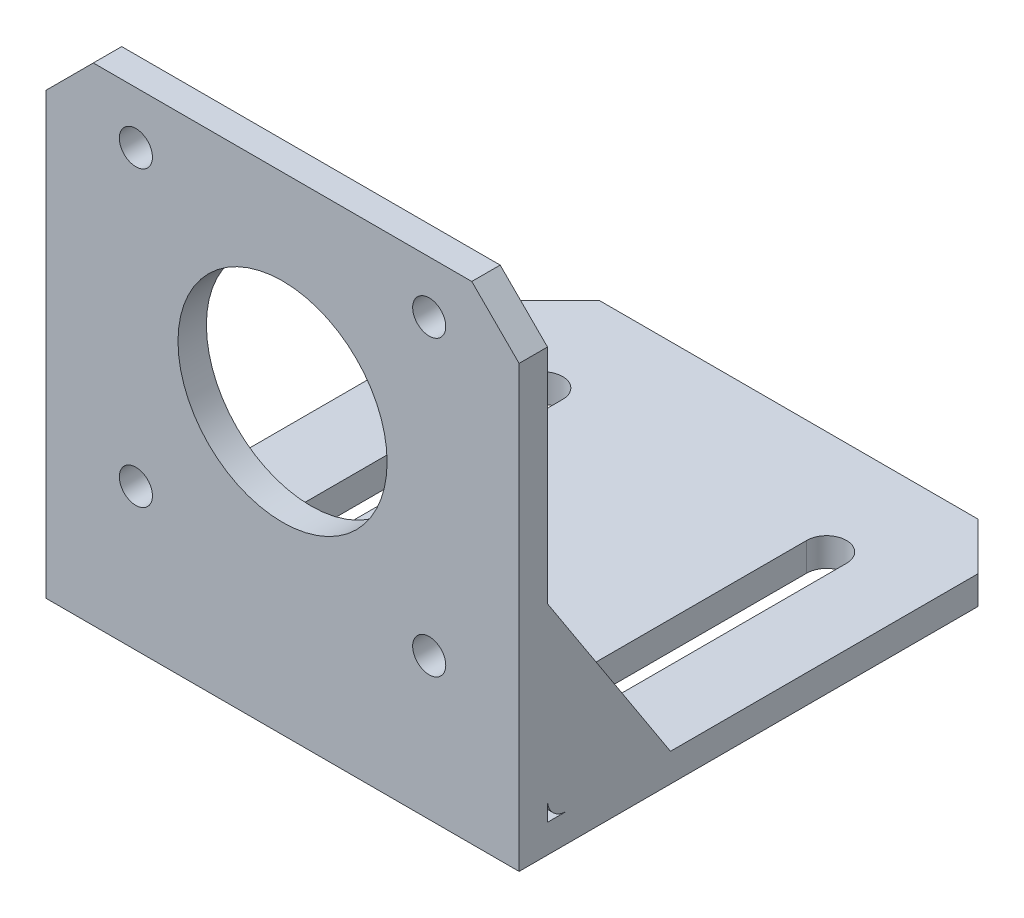
ISO-10303-21;
HEADER;
FILE_DESCRIPTION(('STEP AP214'),'2;1');
FILE_NAME('part.step','',(''),(''),'','','');
FILE_SCHEMA(('AUTOMOTIVE_DESIGN { 1 0 10303 214 1 1 1 1 }'));
ENDSEC;
DATA;
#1=APPLICATION_CONTEXT('core data for automotive mechanical design processes');
#2=APPLICATION_PROTOCOL_DEFINITION('international standard','automotive_design',2000,#1);
#3=PRODUCT_CONTEXT('',#1,'mechanical');
#4=PRODUCT('Part','Part','',(#3));
#5=PRODUCT_RELATED_PRODUCT_CATEGORY('part','',(#4));
#6=PRODUCT_DEFINITION_FORMATION('','',#4);
#7=PRODUCT_DEFINITION_CONTEXT('part definition',#1,'design');
#8=PRODUCT_DEFINITION('design','',#6,#7);
#9=PRODUCT_DEFINITION_SHAPE('','',#8);
#10=(LENGTH_UNIT() NAMED_UNIT(*) SI_UNIT(.MILLI.,.METRE.));
#11=(NAMED_UNIT(*) PLANE_ANGLE_UNIT() SI_UNIT($,.RADIAN.));
#12=(NAMED_UNIT(*) SI_UNIT($,.STERADIAN.) SOLID_ANGLE_UNIT());
#13=UNCERTAINTY_MEASURE_WITH_UNIT(LENGTH_MEASURE(1.E-05),#10,'distance_accuracy_value','');
#14=(GEOMETRIC_REPRESENTATION_CONTEXT(3) GLOBAL_UNCERTAINTY_ASSIGNED_CONTEXT((#13)) GLOBAL_UNIT_ASSIGNED_CONTEXT((#10,
#11,#12)) REPRESENTATION_CONTEXT('',''));
#15=CARTESIAN_POINT('',(0.,0.,0.));
#16=DIRECTION('',(0.,0.,1.));
#17=DIRECTION('',(1.,0.,0.));
#18=AXIS2_PLACEMENT_3D('',#15,#16,#17);
#19=CARTESIAN_POINT('',(50.,-51.5,0.));
#20=DIRECTION('',(0.,0.,-1.));
#21=DIRECTION('',(-1.,0.,0.));
#22=AXIS2_PLACEMENT_3D('',#19,#20,#21);
#23=PLANE('',#22);
#24=CARTESIAN_POINT('',(40.5,-36.5,0.));
#25=DIRECTION('',(0.,0.,-1.));
#26=DIRECTION('',(0.,1.,0.));
#27=AXIS2_PLACEMENT_3D('',#24,#25,#26);
#28=CIRCLE('',#27,1.75);
#29=CARTESIAN_POINT('',(40.5,-34.75,0.));
#30=VERTEX_POINT('',#29);
#31=EDGE_CURVE('E333',#30,#30,#28,.T.);
#32=ORIENTED_EDGE('',*,*,#31,.T.);
#33=EDGE_LOOP('',(#32));
#34=FACE_BOUND('',#33,.T.);
#35=CARTESIAN_POINT('',(9.5,-36.5,0.));
#36=DIRECTION('',(0.,0.,-1.));
#37=DIRECTION('',(0.,1.,0.));
#38=AXIS2_PLACEMENT_3D('',#35,#36,#37);
#39=CIRCLE('',#38,1.75);
#40=CARTESIAN_POINT('',(9.5,-34.75,0.));
#41=VERTEX_POINT('',#40);
#42=EDGE_CURVE('E352',#41,#41,#39,.T.);
#43=ORIENTED_EDGE('',*,*,#42,.T.);
#44=EDGE_LOOP('',(#43));
#45=FACE_BOUND('',#44,.T.);
#46=CARTESIAN_POINT('',(9.5,-5.50000000000001,0.));
#47=DIRECTION('',(0.,0.,-1.));
#48=DIRECTION('',(0.,1.,0.));
#49=AXIS2_PLACEMENT_3D('',#46,#47,#48);
#50=CIRCLE('',#49,1.75);
#51=CARTESIAN_POINT('',(9.5,-3.75,0.));
#52=VERTEX_POINT('',#51);
#53=EDGE_CURVE('E346',#52,#52,#50,.T.);
#54=ORIENTED_EDGE('',*,*,#53,.T.);
#55=EDGE_LOOP('',(#54));
#56=FACE_BOUND('',#55,.T.);
#57=CARTESIAN_POINT('',(40.5,-5.50000000000001,0.));
#58=DIRECTION('',(0.,0.,-1.));
#59=DIRECTION('',(0.,1.,0.));
#60=AXIS2_PLACEMENT_3D('',#57,#58,#59);
#61=CIRCLE('',#60,1.75);
#62=CARTESIAN_POINT('',(40.5,-3.75,0.));
#63=VERTEX_POINT('',#62);
#64=EDGE_CURVE('E360',#63,#63,#61,.T.);
#65=ORIENTED_EDGE('',*,*,#64,.T.);
#66=EDGE_LOOP('',(#65));
#67=FACE_BOUND('',#66,.T.);
#68=CARTESIAN_POINT('',(25.,-21.,0.));
#69=DIRECTION('',(0.,0.,-1.));
#70=DIRECTION('',(0.,1.,0.));
#71=AXIS2_PLACEMENT_3D('',#68,#69,#70);
#72=CIRCLE('',#71,11.05);
#73=CARTESIAN_POINT('',(25.,-9.95,0.));
#74=VERTEX_POINT('',#73);
#75=EDGE_CURVE('E366',#74,#74,#72,.T.);
#76=ORIENTED_EDGE('',*,*,#75,.T.);
#77=EDGE_LOOP('',(#76));
#78=FACE_BOUND('',#77,.T.);
#79=DIRECTION('',(0.,-1.,0.));
#80=VECTOR('',#79,1.);
#81=CARTESIAN_POINT('',(50.,-51.5,0.));
#82=LINE('',#81,#80);
#83=CARTESIAN_POINT('',(50.,-4.99999999999999,0.));
#84=VERTEX_POINT('',#83);
#85=CARTESIAN_POINT('',(50.,-51.5,0.));
#86=VERTEX_POINT('',#85);
#87=EDGE_CURVE('E372',#84,#86,#82,.T.);
#88=ORIENTED_EDGE('',*,*,#87,.F.);
#89=DIRECTION('',(0.707106781186549,-0.707106781186547,0.));
#90=VECTOR('',#89,1.);
#91=CARTESIAN_POINT('',(50.,-4.99999999999999,0.));
#92=LINE('',#91,#90);
#93=CARTESIAN_POINT('',(45.,0.,0.));
#94=VERTEX_POINT('',#93);
#95=EDGE_CURVE('E439',#84,#94,#92,.F.);
#96=ORIENTED_EDGE('',*,*,#95,.T.);
#97=DIRECTION('',(-1.,0.,0.));
#98=VECTOR('',#97,1.);
#99=CARTESIAN_POINT('',(50.,0.,0.));
#100=LINE('',#99,#98);
#101=CARTESIAN_POINT('',(4.99999999999999,0.,0.));
#102=VERTEX_POINT('',#101);
#103=EDGE_CURVE('E386',#94,#102,#100,.T.);
#104=ORIENTED_EDGE('',*,*,#103,.T.);
#105=DIRECTION('',(-0.707106781186547,-0.707106781186549,0.));
#106=VECTOR('',#105,1.);
#107=CARTESIAN_POINT('',(4.99999999999999,0.,0.));
#108=LINE('',#107,#106);
#109=CARTESIAN_POINT('',(0.,-5.,0.));
#110=VERTEX_POINT('',#109);
#111=EDGE_CURVE('E437',#102,#110,#108,.T.);
#112=ORIENTED_EDGE('',*,*,#111,.T.);
#113=DIRECTION('',(0.,-1.,0.));
#114=VECTOR('',#113,1.);
#115=CARTESIAN_POINT('',(0.,-51.5,0.));
#116=LINE('',#115,#114);
#117=CARTESIAN_POINT('',(0.,-51.5,0.));
#118=VERTEX_POINT('',#117);
#119=EDGE_CURVE('E369',#110,#118,#116,.T.);
#120=ORIENTED_EDGE('',*,*,#119,.T.);
#121=DIRECTION('',(-1.,0.,0.));
#122=VECTOR('',#121,1.);
#123=CARTESIAN_POINT('',(50.,-51.5,0.));
#124=LINE('',#123,#122);
#125=EDGE_CURVE('E410',#86,#118,#124,.T.);
#126=ORIENTED_EDGE('',*,*,#125,.F.);
#127=EDGE_LOOP('',(#88,#96,#104,#112,#120,#126));
#128=FACE_BOUND('',#127,.T.);
#129=ADVANCED_FACE('F41',(#34,#45,#56,#67,#78,#128),#23,.F.);
#130=CARTESIAN_POINT('',(50.,-51.5,-53.5));
#131=DIRECTION('',(0.,1.,0.));
#132=DIRECTION('',(0.,0.,1.));
#133=AXIS2_PLACEMENT_3D('',#130,#131,#132);
#134=PLANE('',#133);
#135=DIRECTION('',(0.,0.,-1.));
#136=VECTOR('',#135,1.);
#137=CARTESIAN_POINT('',(12.1,-51.5,-42.5));
#138=LINE('',#137,#136);
#139=CARTESIAN_POINT('',(12.1,-51.5,-12.5));
#140=VERTEX_POINT('',#139);
#141=CARTESIAN_POINT('',(12.1,-51.5,-42.5));
#142=VERTEX_POINT('',#141);
#143=EDGE_CURVE('E227',#140,#142,#138,.T.);
#144=ORIENTED_EDGE('',*,*,#143,.T.);
#145=CARTESIAN_POINT('',(9.99999999999999,-51.5,-42.5));
#146=DIRECTION('',(0.,1.,0.));
#147=DIRECTION('',(0.,0.,1.));
#148=AXIS2_PLACEMENT_3D('',#145,#146,#147);
#149=CIRCLE('',#148,2.1);
#150=CARTESIAN_POINT('',(7.89999999999999,-51.5,-42.5));
#151=VERTEX_POINT('',#150);
#152=EDGE_CURVE('E219',#142,#151,#149,.T.);
#153=ORIENTED_EDGE('',*,*,#152,.T.);
#154=DIRECTION('',(0.,0.,1.));
#155=VECTOR('',#154,1.);
#156=CARTESIAN_POINT('',(7.89999999999999,-51.5,-42.5));
#157=LINE('',#156,#155);
#158=CARTESIAN_POINT('',(7.89999999999999,-51.5,-12.5));
#159=VERTEX_POINT('',#158);
#160=EDGE_CURVE('E230',#151,#159,#157,.T.);
#161=ORIENTED_EDGE('',*,*,#160,.T.);
#162=CARTESIAN_POINT('',(9.99999999999999,-51.5,-12.5));
#163=DIRECTION('',(0.,1.,0.));
#164=DIRECTION('',(0.,0.,1.));
#165=AXIS2_PLACEMENT_3D('',#162,#163,#164);
#166=CIRCLE('',#165,2.1);
#167=EDGE_CURVE('E57',#159,#140,#166,.T.);
#168=ORIENTED_EDGE('',*,*,#167,.T.);
#169=EDGE_LOOP('',(#144,#153,#161,#168));
#170=FACE_BOUND('',#169,.T.);
#171=DIRECTION('',(0.,0.,-1.));
#172=VECTOR('',#171,1.);
#173=CARTESIAN_POINT('',(42.1,-51.5,-42.5));
#174=LINE('',#173,#172);
#175=CARTESIAN_POINT('',(42.1,-51.5,-12.5));
#176=VERTEX_POINT('',#175);
#177=CARTESIAN_POINT('',(42.1,-51.5,-42.5));
#178=VERTEX_POINT('',#177);
#179=EDGE_CURVE('E260',#176,#178,#174,.T.);
#180=ORIENTED_EDGE('',*,*,#179,.T.);
#181=CARTESIAN_POINT('',(40.,-51.5,-42.5));
#182=DIRECTION('',(0.,1.,0.));
#183=DIRECTION('',(0.,0.,1.));
#184=AXIS2_PLACEMENT_3D('',#181,#182,#183);
#185=CIRCLE('',#184,2.1);
#186=CARTESIAN_POINT('',(37.9,-51.5,-42.5));
#187=VERTEX_POINT('',#186);
#188=EDGE_CURVE('E271',#178,#187,#185,.T.);
#189=ORIENTED_EDGE('',*,*,#188,.T.);
#190=DIRECTION('',(0.,0.,1.));
#191=VECTOR('',#190,1.);
#192=CARTESIAN_POINT('',(37.9,-51.5,-42.5));
#193=LINE('',#192,#191);
#194=CARTESIAN_POINT('',(37.9,-51.5,-12.5));
#195=VERTEX_POINT('',#194);
#196=EDGE_CURVE('E281',#187,#195,#193,.T.);
#197=ORIENTED_EDGE('',*,*,#196,.T.);
#198=CARTESIAN_POINT('',(40.,-51.5,-12.5));
#199=DIRECTION('',(0.,1.,0.));
#200=DIRECTION('',(0.,0.,1.));
#201=AXIS2_PLACEMENT_3D('',#198,#199,#200);
#202=CIRCLE('',#201,2.10000000000001);
#203=EDGE_CURVE('E65',#195,#176,#202,.T.);
#204=ORIENTED_EDGE('',*,*,#203,.T.);
#205=EDGE_LOOP('',(#180,#189,#197,#204));
#206=FACE_BOUND('',#205,.T.);
#207=DIRECTION('',(0.,0.,-1.));
#208=VECTOR('',#207,1.);
#209=CARTESIAN_POINT('',(0.,-51.5,-53.5));
#210=LINE('',#209,#208);
#211=CARTESIAN_POINT('',(0.,-51.5,-48.5));
#212=VERTEX_POINT('',#211);
#213=EDGE_CURVE('E388',#118,#212,#210,.T.);
#214=ORIENTED_EDGE('',*,*,#213,.T.);
#215=DIRECTION('',(0.707106781186547,0.,-0.707106781186548));
#216=VECTOR('',#215,1.);
#217=CARTESIAN_POINT('',(4.99999999999998,-51.5,-53.5));
#218=LINE('',#217,#216);
#219=CARTESIAN_POINT('',(4.99999999999999,-51.5,-53.5));
#220=VERTEX_POINT('',#219);
#221=EDGE_CURVE('E429',#212,#220,#218,.T.);
#222=ORIENTED_EDGE('',*,*,#221,.T.);
#223=DIRECTION('',(-1.,0.,0.));
#224=VECTOR('',#223,1.);
#225=CARTESIAN_POINT('',(50.,-51.5,-53.5));
#226=LINE('',#225,#224);
#227=CARTESIAN_POINT('',(45.,-51.5,-53.5));
#228=VERTEX_POINT('',#227);
#229=EDGE_CURVE('E407',#228,#220,#226,.T.);
#230=ORIENTED_EDGE('',*,*,#229,.F.);
#231=DIRECTION('',(-0.70710678118655,0.,-0.707106781186545));
#232=VECTOR('',#231,1.);
#233=CARTESIAN_POINT('',(50.0000000000001,-51.5,-48.4999999999999));
#234=LINE('',#233,#232);
#235=CARTESIAN_POINT('',(50.,-51.5,-48.5));
#236=VERTEX_POINT('',#235);
#237=EDGE_CURVE('E427',#228,#236,#234,.F.);
#238=ORIENTED_EDGE('',*,*,#237,.T.);
#239=DIRECTION('',(0.,0.,-1.));
#240=VECTOR('',#239,1.);
#241=CARTESIAN_POINT('',(50.,-51.5,-53.5));
#242=LINE('',#241,#240);
#243=EDGE_CURVE('E374',#86,#236,#242,.T.);
#244=ORIENTED_EDGE('',*,*,#243,.F.);
#245=ORIENTED_EDGE('',*,*,#125,.T.);
#246=EDGE_LOOP('',(#214,#222,#230,#238,#244,#245));
#247=FACE_BOUND('',#246,.T.);
#248=ADVANCED_FACE('F234',(#170,#206,#247),#134,.F.);
#249=CARTESIAN_POINT('',(50.,-48.5,-53.5));
#250=DIRECTION('',(0.,0.,1.));
#251=DIRECTION('',(0.,-1.,0.));
#252=AXIS2_PLACEMENT_3D('',#249,#250,#251);
#253=PLANE('',#252);
#254=ORIENTED_EDGE('',*,*,#229,.T.);
#255=DIRECTION('',(0.,1.,0.));
#256=VECTOR('',#255,1.);
#257=CARTESIAN_POINT('',(4.99999999999999,-48.5,-53.5));
#258=LINE('',#257,#256);
#259=CARTESIAN_POINT('',(4.99999999999999,-48.5,-53.5));
#260=VERTEX_POINT('',#259);
#261=EDGE_CURVE('E415',#220,#260,#258,.T.);
#262=ORIENTED_EDGE('',*,*,#261,.T.);
#263=DIRECTION('',(-1.,0.,0.));
#264=VECTOR('',#263,1.);
#265=CARTESIAN_POINT('',(50.,-48.5,-53.5));
#266=LINE('',#265,#264);
#267=CARTESIAN_POINT('',(45.,-48.5,-53.5));
#268=VERTEX_POINT('',#267);
#269=EDGE_CURVE('E404',#268,#260,#266,.T.);
#270=ORIENTED_EDGE('',*,*,#269,.F.);
#271=DIRECTION('',(0.,-1.,0.));
#272=VECTOR('',#271,1.);
#273=CARTESIAN_POINT('',(45.,-48.5,-53.5));
#274=LINE('',#273,#272);
#275=EDGE_CURVE('E413',#268,#228,#274,.T.);
#276=ORIENTED_EDGE('',*,*,#275,.T.);
#277=EDGE_LOOP('',(#254,#262,#270,#276));
#278=FACE_BOUND('',#277,.T.);
#279=ADVANCED_FACE('F516',(#278),#253,.F.);
#280=CARTESIAN_POINT('',(50.,-48.5,-3.00000000000001));
#281=DIRECTION('',(0.,-1.,0.));
#282=DIRECTION('',(0.,0.,-1.));
#283=AXIS2_PLACEMENT_3D('',#280,#281,#282);
#284=PLANE('',#283);
#285=DIRECTION('',(0.,0.,1.));
#286=VECTOR('',#285,1.);
#287=CARTESIAN_POINT('',(7.89999999999999,-48.5,-42.5));
#288=LINE('',#287,#286);
#289=CARTESIAN_POINT('',(7.89999999999999,-48.5,-42.5));
#290=VERTEX_POINT('',#289);
#291=CARTESIAN_POINT('',(7.89999999999999,-48.5,-12.5));
#292=VERTEX_POINT('',#291);
#293=EDGE_CURVE('E246',#290,#292,#288,.T.);
#294=ORIENTED_EDGE('',*,*,#293,.F.);
#295=CARTESIAN_POINT('',(9.99999999999999,-48.5,-42.5));
#296=DIRECTION('',(0.,1.,0.));
#297=DIRECTION('',(0.,0.,1.));
#298=AXIS2_PLACEMENT_3D('',#295,#296,#297);
#299=CIRCLE('',#298,2.1);
#300=CARTESIAN_POINT('',(12.1,-48.5,-42.5));
#301=VERTEX_POINT('',#300);
#302=EDGE_CURVE('E222',#301,#290,#299,.T.);
#303=ORIENTED_EDGE('',*,*,#302,.F.);
#304=DIRECTION('',(0.,0.,-1.));
#305=VECTOR('',#304,1.);
#306=CARTESIAN_POINT('',(12.1,-48.5,-42.5));
#307=LINE('',#306,#305);
#308=CARTESIAN_POINT('',(12.1,-48.5,-12.5));
#309=VERTEX_POINT('',#308);
#310=EDGE_CURVE('E237',#309,#301,#307,.T.);
#311=ORIENTED_EDGE('',*,*,#310,.F.);
#312=CARTESIAN_POINT('',(9.99999999999999,-48.5,-12.5));
#313=DIRECTION('',(0.,1.,0.));
#314=DIRECTION('',(0.,0.,1.));
#315=AXIS2_PLACEMENT_3D('',#312,#313,#314);
#316=CIRCLE('',#315,2.1);
#317=EDGE_CURVE('E240',#292,#309,#316,.T.);
#318=ORIENTED_EDGE('',*,*,#317,.F.);
#319=EDGE_LOOP('',(#294,#303,#311,#318));
#320=FACE_BOUND('',#319,.T.);
#321=DIRECTION('',(0.,0.,1.));
#322=VECTOR('',#321,1.);
#323=CARTESIAN_POINT('',(37.9,-48.5,-42.5));
#324=LINE('',#323,#322);
#325=CARTESIAN_POINT('',(37.9,-48.5,-42.5));
#326=VERTEX_POINT('',#325);
#327=CARTESIAN_POINT('',(37.9,-48.5,-12.5));
#328=VERTEX_POINT('',#327);
#329=EDGE_CURVE('E274',#326,#328,#324,.T.);
#330=ORIENTED_EDGE('',*,*,#329,.F.);
#331=CARTESIAN_POINT('',(40.,-48.5,-42.5));
#332=DIRECTION('',(0.,1.,0.));
#333=DIRECTION('',(0.,0.,1.));
#334=AXIS2_PLACEMENT_3D('',#331,#332,#333);
#335=CIRCLE('',#334,2.1);
#336=CARTESIAN_POINT('',(42.1,-48.5,-42.5));
#337=VERTEX_POINT('',#336);
#338=EDGE_CURVE('E247',#337,#326,#335,.T.);
#339=ORIENTED_EDGE('',*,*,#338,.F.);
#340=DIRECTION('',(0.,0.,-1.));
#341=VECTOR('',#340,1.);
#342=CARTESIAN_POINT('',(42.1,-48.5,-42.5));
#343=LINE('',#342,#341);
#344=CARTESIAN_POINT('',(42.1,-48.5,-12.5));
#345=VERTEX_POINT('',#344);
#346=EDGE_CURVE('E267',#345,#337,#343,.T.);
#347=ORIENTED_EDGE('',*,*,#346,.F.);
#348=CARTESIAN_POINT('',(40.,-48.5,-12.5));
#349=DIRECTION('',(0.,1.,0.));
#350=DIRECTION('',(0.,0.,1.));
#351=AXIS2_PLACEMENT_3D('',#348,#349,#350);
#352=CIRCLE('',#351,2.10000000000001);
#353=EDGE_CURVE('E270',#328,#345,#352,.T.);
#354=ORIENTED_EDGE('',*,*,#353,.F.);
#355=EDGE_LOOP('',(#330,#339,#347,#354));
#356=FACE_BOUND('',#355,.T.);
#357=DIRECTION('',(0.,0.,1.));
#358=VECTOR('',#357,1.);
#359=CARTESIAN_POINT('',(0.,-48.5,-3.00000000000001));
#360=LINE('',#359,#358);
#361=CARTESIAN_POINT('',(0.,-48.5,-48.5));
#362=VERTEX_POINT('',#361);
#363=CARTESIAN_POINT('',(0.,-48.5,-16.));
#364=VERTEX_POINT('',#363);
#365=EDGE_CURVE('E392',#362,#364,#360,.T.);
#366=ORIENTED_EDGE('',*,*,#365,.T.);
#367=DIRECTION('',(-1.,0.,0.));
#368=VECTOR('',#367,1.);
#369=CARTESIAN_POINT('',(3.,-48.5,-16.));
#370=LINE('',#369,#368);
#371=CARTESIAN_POINT('',(3.,-48.5,-16.));
#372=VERTEX_POINT('',#371);
#373=EDGE_CURVE('E297',#372,#364,#370,.T.);
#374=ORIENTED_EDGE('',*,*,#373,.F.);
#375=DIRECTION('',(0.,0.,1.));
#376=VECTOR('',#375,1.);
#377=CARTESIAN_POINT('',(3.,-48.5,-5.00000000000002));
#378=LINE('',#377,#376);
#379=CARTESIAN_POINT('',(3.,-48.5,-5.00000000000001));
#380=VERTEX_POINT('',#379);
#381=EDGE_CURVE('E289',#372,#380,#378,.T.);
#382=ORIENTED_EDGE('',*,*,#381,.T.);
#383=DIRECTION('',(-1.,0.,0.));
#384=VECTOR('',#383,1.);
#385=CARTESIAN_POINT('',(3.,-48.5,-5.00000000000002));
#386=LINE('',#385,#384);
#387=CARTESIAN_POINT('',(0.,-48.5,-5.00000000000002));
#388=VERTEX_POINT('',#387);
#389=EDGE_CURVE('E309',#380,#388,#386,.T.);
#390=ORIENTED_EDGE('',*,*,#389,.T.);
#391=CARTESIAN_POINT('',(0.,-48.5,-3.00000000000001));
#392=VERTEX_POINT('',#391);
#393=EDGE_CURVE('E391',#388,#392,#360,.T.);
#394=ORIENTED_EDGE('',*,*,#393,.T.);
#395=DIRECTION('',(-1.,0.,0.));
#396=VECTOR('',#395,1.);
#397=CARTESIAN_POINT('',(50.,-48.5,-3.00000000000001));
#398=LINE('',#397,#396);
#399=CARTESIAN_POINT('',(50.,-48.5,-3.00000000000001));
#400=VERTEX_POINT('',#399);
#401=EDGE_CURVE('E401',#400,#392,#398,.T.);
#402=ORIENTED_EDGE('',*,*,#401,.F.);
#403=DIRECTION('',(0.,0.,1.));
#404=VECTOR('',#403,1.);
#405=CARTESIAN_POINT('',(50.,-48.5,-3.00000000000001));
#406=LINE('',#405,#404);
#407=CARTESIAN_POINT('',(50.,-48.5,-5.00000000000001));
#408=VERTEX_POINT('',#407);
#409=EDGE_CURVE('E378',#408,#400,#406,.T.);
#410=ORIENTED_EDGE('',*,*,#409,.F.);
#411=DIRECTION('',(1.,0.,0.));
#412=VECTOR('',#411,1.);
#413=CARTESIAN_POINT('',(47.,-48.5,-5.00000000000002));
#414=LINE('',#413,#412);
#415=CARTESIAN_POINT('',(47.,-48.5,-5.00000000000002));
#416=VERTEX_POINT('',#415);
#417=EDGE_CURVE('E337',#416,#408,#414,.T.);
#418=ORIENTED_EDGE('',*,*,#417,.F.);
#419=DIRECTION('',(0.,0.,-1.));
#420=VECTOR('',#419,1.);
#421=CARTESIAN_POINT('',(47.,-48.5,-5.00000000000002));
#422=LINE('',#421,#420);
#423=CARTESIAN_POINT('',(47.,-48.5,-16.));
#424=VERTEX_POINT('',#423);
#425=EDGE_CURVE('E321',#416,#424,#422,.T.);
#426=ORIENTED_EDGE('',*,*,#425,.T.);
#427=DIRECTION('',(1.,0.,0.));
#428=VECTOR('',#427,1.);
#429=CARTESIAN_POINT('',(47.,-48.5,-16.));
#430=LINE('',#429,#428);
#431=CARTESIAN_POINT('',(50.,-48.5,-16.));
#432=VERTEX_POINT('',#431);
#433=EDGE_CURVE('E334',#424,#432,#430,.T.);
#434=ORIENTED_EDGE('',*,*,#433,.T.);
#435=CARTESIAN_POINT('',(50.,-48.5,-48.5));
#436=VERTEX_POINT('',#435);
#437=EDGE_CURVE('E379',#436,#432,#406,.T.);
#438=ORIENTED_EDGE('',*,*,#437,.F.);
#439=DIRECTION('',(0.70710678118655,0.,0.707106781186545));
#440=VECTOR('',#439,1.);
#441=CARTESIAN_POINT('',(50.0000000000001,-48.5,-48.4999999999999));
#442=LINE('',#441,#440);
#443=EDGE_CURVE('E418',#436,#268,#442,.F.);
#444=ORIENTED_EDGE('',*,*,#443,.T.);
#445=ORIENTED_EDGE('',*,*,#269,.T.);
#446=DIRECTION('',(-0.707106781186547,0.,0.707106781186548));
#447=VECTOR('',#446,1.);
#448=CARTESIAN_POINT('',(4.99999999999999,-48.5,-53.5));
#449=LINE('',#448,#447);
#450=EDGE_CURVE('E420',#260,#362,#449,.T.);
#451=ORIENTED_EDGE('',*,*,#450,.T.);
#452=EDGE_LOOP('',(#366,#374,#382,#390,#394,#402,#410,#418,#426,#434,#438,#444,#445,#451));
#453=FACE_BOUND('',#452,.T.);
#454=ADVANCED_FACE('F487',(#320,#356,#453),#284,.F.);
#455=CARTESIAN_POINT('',(50.,0.,-3.));
#456=DIRECTION('',(0.,0.,1.));
#457=DIRECTION('',(0.,-1.,0.));
#458=AXIS2_PLACEMENT_3D('',#455,#456,#457);
#459=PLANE('',#458);
#460=DIRECTION('',(0.,1.,0.));
#461=VECTOR('',#460,1.);
#462=CARTESIAN_POINT('',(3.,-28.5,-3.00000000000001));
#463=LINE('',#462,#461);
#464=CARTESIAN_POINT('',(3.,-46.5,-3.00000000000001));
#465=VERTEX_POINT('',#464);
#466=CARTESIAN_POINT('',(3.,-28.5,-3.));
#467=VERTEX_POINT('',#466);
#468=EDGE_CURVE('E295',#465,#467,#463,.T.);
#469=ORIENTED_EDGE('',*,*,#468,.T.);
#470=DIRECTION('',(-1.,0.,0.));
#471=VECTOR('',#470,1.);
#472=CARTESIAN_POINT('',(3.,-28.5,-3.00000000000001));
#473=LINE('',#472,#471);
#474=CARTESIAN_POINT('',(0.,-28.5,-3.00000000000001));
#475=VERTEX_POINT('',#474);
#476=EDGE_CURVE('E302',#467,#475,#473,.T.);
#477=ORIENTED_EDGE('',*,*,#476,.T.);
#478=DIRECTION('',(0.,1.,0.));
#479=VECTOR('',#478,1.);
#480=CARTESIAN_POINT('',(0.,0.,-3.));
#481=LINE('',#480,#479);
#482=CARTESIAN_POINT('',(0.,-5.,-3.));
#483=VERTEX_POINT('',#482);
#484=EDGE_CURVE('E394',#475,#483,#481,.T.);
#485=ORIENTED_EDGE('',*,*,#484,.T.);
#486=DIRECTION('',(0.707106781186546,0.707106781186548,0.));
#487=VECTOR('',#486,1.);
#488=CARTESIAN_POINT('',(4.99999999999999,0.,-3.));
#489=LINE('',#488,#487);
#490=CARTESIAN_POINT('',(4.99999999999999,0.,-3.));
#491=VERTEX_POINT('',#490);
#492=EDGE_CURVE('E50',#483,#491,#489,.T.);
#493=ORIENTED_EDGE('',*,*,#492,.T.);
#494=DIRECTION('',(-1.,0.,0.));
#495=VECTOR('',#494,1.);
#496=CARTESIAN_POINT('',(50.,0.,-3.));
#497=LINE('',#496,#495);
#498=CARTESIAN_POINT('',(45.,0.,-3.));
#499=VERTEX_POINT('',#498);
#500=EDGE_CURVE('E398',#499,#491,#497,.T.);
#501=ORIENTED_EDGE('',*,*,#500,.F.);
#502=DIRECTION('',(-0.707106781186548,0.707106781186546,0.));
#503=VECTOR('',#502,1.);
#504=CARTESIAN_POINT('',(50.,-4.99999999999999,-3.));
#505=LINE('',#504,#503);
#506=CARTESIAN_POINT('',(50.,-4.99999999999999,-3.));
#507=VERTEX_POINT('',#506);
#508=EDGE_CURVE('E11',#499,#507,#505,.F.);
#509=ORIENTED_EDGE('',*,*,#508,.T.);
#510=DIRECTION('',(0.,1.,0.));
#511=VECTOR('',#510,1.);
#512=CARTESIAN_POINT('',(50.,0.,-3.));
#513=LINE('',#512,#511);
#514=CARTESIAN_POINT('',(50.,-28.5,-3.));
#515=VERTEX_POINT('',#514);
#516=EDGE_CURVE('E382',#515,#507,#513,.T.);
#517=ORIENTED_EDGE('',*,*,#516,.F.);
#518=DIRECTION('',(1.,0.,0.));
#519=VECTOR('',#518,1.);
#520=CARTESIAN_POINT('',(47.,-28.5,-3.00000000000001));
#521=LINE('',#520,#519);
#522=CARTESIAN_POINT('',(47.,-28.5,-3.00000000000001));
#523=VERTEX_POINT('',#522);
#524=EDGE_CURVE('E330',#523,#515,#521,.T.);
#525=ORIENTED_EDGE('',*,*,#524,.F.);
#526=DIRECTION('',(0.,-1.,0.));
#527=VECTOR('',#526,1.);
#528=CARTESIAN_POINT('',(47.,-28.5,-3.00000000000001));
#529=LINE('',#528,#527);
#530=CARTESIAN_POINT('',(47.,-46.5,-3.00000000000001));
#531=VERTEX_POINT('',#530);
#532=EDGE_CURVE('E314',#523,#531,#529,.T.);
#533=ORIENTED_EDGE('',*,*,#532,.T.);
#534=DIRECTION('',(1.,0.,0.));
#535=VECTOR('',#534,1.);
#536=CARTESIAN_POINT('',(47.,-46.5,-3.00000000000001));
#537=LINE('',#536,#535);
#538=CARTESIAN_POINT('',(50.,-46.5,-3.00000000000001));
#539=VERTEX_POINT('',#538);
#540=EDGE_CURVE('E327',#531,#539,#537,.T.);
#541=ORIENTED_EDGE('',*,*,#540,.T.);
#542=EDGE_CURVE('E383',#400,#539,#513,.T.);
#543=ORIENTED_EDGE('',*,*,#542,.F.);
#544=ORIENTED_EDGE('',*,*,#401,.T.);
#545=CARTESIAN_POINT('',(0.,-46.5,-3.00000000000001));
#546=VERTEX_POINT('',#545);
#547=EDGE_CURVE('E375',#392,#546,#481,.T.);
#548=ORIENTED_EDGE('',*,*,#547,.T.);
#549=DIRECTION('',(-1.,0.,0.));
#550=VECTOR('',#549,1.);
#551=CARTESIAN_POINT('',(3.,-46.5,-3.00000000000001));
#552=LINE('',#551,#550);
#553=EDGE_CURVE('E306',#465,#546,#552,.T.);
#554=ORIENTED_EDGE('',*,*,#553,.F.);
#555=EDGE_LOOP('',(#469,#477,#485,#493,#501,#509,#517,#525,#533,#541,#543,#544,#548,#554));
#556=FACE_BOUND('',#555,.T.);
#557=CARTESIAN_POINT('',(40.5,-36.5,-3.));
#558=DIRECTION('',(0.,0.,-1.));
#559=DIRECTION('',(0.,1.,0.));
#560=AXIS2_PLACEMENT_3D('',#557,#558,#559);
#561=CIRCLE('',#560,1.75);
#562=CARTESIAN_POINT('',(40.5,-34.75,-3.));
#563=VERTEX_POINT('',#562);
#564=EDGE_CURVE('E355',#563,#563,#561,.T.);
#565=ORIENTED_EDGE('',*,*,#564,.F.);
#566=EDGE_LOOP('',(#565));
#567=FACE_BOUND('',#566,.T.);
#568=CARTESIAN_POINT('',(9.5,-36.5,-3.));
#569=DIRECTION('',(0.,0.,-1.));
#570=DIRECTION('',(0.,1.,0.));
#571=AXIS2_PLACEMENT_3D('',#568,#569,#570);
#572=CIRCLE('',#571,1.75);
#573=CARTESIAN_POINT('',(9.5,-34.75,-3.));
#574=VERTEX_POINT('',#573);
#575=EDGE_CURVE('E349',#574,#574,#572,.T.);
#576=ORIENTED_EDGE('',*,*,#575,.F.);
#577=EDGE_LOOP('',(#576));
#578=FACE_BOUND('',#577,.T.);
#579=CARTESIAN_POINT('',(9.5,-5.50000000000001,-3.));
#580=DIRECTION('',(0.,0.,-1.));
#581=DIRECTION('',(0.,1.,0.));
#582=AXIS2_PLACEMENT_3D('',#579,#580,#581);
#583=CIRCLE('',#582,1.75);
#584=CARTESIAN_POINT('',(9.5,-3.75,-3.));
#585=VERTEX_POINT('',#584);
#586=EDGE_CURVE('E342',#585,#585,#583,.T.);
#587=ORIENTED_EDGE('',*,*,#586,.F.);
#588=EDGE_LOOP('',(#587));
#589=FACE_BOUND('',#588,.T.);
#590=CARTESIAN_POINT('',(40.5,-5.50000000000001,-3.));
#591=DIRECTION('',(0.,0.,-1.));
#592=DIRECTION('',(0.,1.,0.));
#593=AXIS2_PLACEMENT_3D('',#590,#591,#592);
#594=CIRCLE('',#593,1.75);
#595=CARTESIAN_POINT('',(40.5,-3.75,-3.));
#596=VERTEX_POINT('',#595);
#597=EDGE_CURVE('E345',#596,#596,#594,.T.);
#598=ORIENTED_EDGE('',*,*,#597,.F.);
#599=EDGE_LOOP('',(#598));
#600=FACE_BOUND('',#599,.T.);
#601=CARTESIAN_POINT('',(25.,-21.,-3.));
#602=DIRECTION('',(0.,0.,-1.));
#603=DIRECTION('',(0.,1.,0.));
#604=AXIS2_PLACEMENT_3D('',#601,#602,#603);
#605=CIRCLE('',#604,11.05);
#606=CARTESIAN_POINT('',(25.,-9.95,-3.));
#607=VERTEX_POINT('',#606);
#608=EDGE_CURVE('E363',#607,#607,#605,.T.);
#609=ORIENTED_EDGE('',*,*,#608,.F.);
#610=EDGE_LOOP('',(#609));
#611=FACE_BOUND('',#610,.T.);
#612=ADVANCED_FACE('F448',(#556,#567,#578,#589,#600,#611),#459,.F.);
#613=CARTESIAN_POINT('',(50.,0.,0.));
#614=DIRECTION('',(0.,-1.,0.));
#615=DIRECTION('',(0.,0.,-1.));
#616=AXIS2_PLACEMENT_3D('',#613,#614,#615);
#617=PLANE('',#616);
#618=ORIENTED_EDGE('',*,*,#103,.F.);
#619=DIRECTION('',(0.,0.,-1.));
#620=VECTOR('',#619,1.);
#621=CARTESIAN_POINT('',(45.,0.,0.));
#622=LINE('',#621,#620);
#623=EDGE_CURVE('E444',#94,#499,#622,.T.);
#624=ORIENTED_EDGE('',*,*,#623,.T.);
#625=ORIENTED_EDGE('',*,*,#500,.T.);
#626=DIRECTION('',(0.,0.,1.));
#627=VECTOR('',#626,1.);
#628=CARTESIAN_POINT('',(4.99999999999999,0.,0.));
#629=LINE('',#628,#627);
#630=EDGE_CURVE('E441',#491,#102,#629,.T.);
#631=ORIENTED_EDGE('',*,*,#630,.T.);
#632=EDGE_LOOP('',(#618,#624,#625,#631));
#633=FACE_BOUND('',#632,.T.);
#634=ADVANCED_FACE('F456',(#633),#617,.F.);
#635=CARTESIAN_POINT('',(50.,0.,0.));
#636=DIRECTION('',(-1.,0.,0.));
#637=DIRECTION('',(0.,0.,1.));
#638=AXIS2_PLACEMENT_3D('',#635,#636,#637);
#639=PLANE('',#638);
#640=ORIENTED_EDGE('',*,*,#542,.T.);
#641=CARTESIAN_POINT('',(50.,-46.5,-5.00000000000001));
#642=DIRECTION('',(1.,0.,0.));
#643=DIRECTION('',(0.,0.,-1.));
#644=AXIS2_PLACEMENT_3D('',#641,#642,#643);
#645=CIRCLE('',#644,2.);
#646=EDGE_CURVE('E305',#539,#408,#645,.T.);
#647=ORIENTED_EDGE('',*,*,#646,.T.);
#648=ORIENTED_EDGE('',*,*,#409,.T.);
#649=EDGE_LOOP('',(#640,#647,#648));
#650=FACE_BOUND('',#649,.T.);
#651=ORIENTED_EDGE('',*,*,#243,.T.);
#652=DIRECTION('',(0.,1.,0.));
#653=VECTOR('',#652,1.);
#654=CARTESIAN_POINT('',(50.,2.24357569559666E-13,-48.4999999999998));
#655=LINE('',#654,#653);
#656=EDGE_CURVE('E434',#236,#436,#655,.T.);
#657=ORIENTED_EDGE('',*,*,#656,.T.);
#658=ORIENTED_EDGE('',*,*,#437,.T.);
#659=DIRECTION('',(0.,0.838443616300637,0.544988350595414));
#660=VECTOR('',#659,1.);
#661=CARTESIAN_POINT('',(50.,-28.5,-3.00000000000001));
#662=LINE('',#661,#660);
#663=EDGE_CURVE('E318',#432,#515,#662,.T.);
#664=ORIENTED_EDGE('',*,*,#663,.T.);
#665=ORIENTED_EDGE('',*,*,#516,.T.);
#666=DIRECTION('',(0.,0.,1.));
#667=VECTOR('',#666,1.);
#668=CARTESIAN_POINT('',(50.,-4.99999999999999,0.));
#669=LINE('',#668,#667);
#670=EDGE_CURVE('E431',#507,#84,#669,.T.);
#671=ORIENTED_EDGE('',*,*,#670,.T.);
#672=ORIENTED_EDGE('',*,*,#87,.T.);
#673=EDGE_LOOP('',(#651,#657,#658,#664,#665,#671,#672));
#674=FACE_BOUND('',#673,.T.);
#675=ADVANCED_FACE('F472',(#650,#674),#639,.F.);
#676=CARTESIAN_POINT('',(0.,0.,0.));
#677=DIRECTION('',(-1.,0.,0.));
#678=DIRECTION('',(0.,0.,1.));
#679=AXIS2_PLACEMENT_3D('',#676,#677,#678);
#680=PLANE('',#679);
#681=ORIENTED_EDGE('',*,*,#484,.F.);
#682=DIRECTION('',(0.,-0.838443616300637,-0.544988350595414));
#683=VECTOR('',#682,1.);
#684=CARTESIAN_POINT('',(0.,-48.5,-16.));
#685=LINE('',#684,#683);
#686=EDGE_CURVE('E253',#475,#364,#685,.T.);
#687=ORIENTED_EDGE('',*,*,#686,.T.);
#688=ORIENTED_EDGE('',*,*,#365,.F.);
#689=DIRECTION('',(0.,-1.,0.));
#690=VECTOR('',#689,1.);
#691=CARTESIAN_POINT('',(0.,-51.5,-48.5));
#692=LINE('',#691,#690);
#693=EDGE_CURVE('E425',#362,#212,#692,.T.);
#694=ORIENTED_EDGE('',*,*,#693,.T.);
#695=ORIENTED_EDGE('',*,*,#213,.F.);
#696=ORIENTED_EDGE('',*,*,#119,.F.);
#697=DIRECTION('',(0.,0.,-1.));
#698=VECTOR('',#697,1.);
#699=CARTESIAN_POINT('',(0.,-5.,-3.));
#700=LINE('',#699,#698);
#701=EDGE_CURVE('E422',#110,#483,#700,.T.);
#702=ORIENTED_EDGE('',*,*,#701,.T.);
#703=EDGE_LOOP('',(#681,#687,#688,#694,#695,#696,#702));
#704=FACE_BOUND('',#703,.T.);
#705=CARTESIAN_POINT('',(0.,-46.5,-5.00000000000001));
#706=DIRECTION('',(-1.,0.,0.));
#707=DIRECTION('',(0.,0.,1.));
#708=AXIS2_PLACEMENT_3D('',#705,#706,#707);
#709=CIRCLE('',#708,2.);
#710=EDGE_CURVE('E290',#388,#546,#709,.T.);
#711=ORIENTED_EDGE('',*,*,#710,.T.);
#712=ORIENTED_EDGE('',*,*,#547,.F.);
#713=ORIENTED_EDGE('',*,*,#393,.F.);
#714=EDGE_LOOP('',(#711,#712,#713));
#715=FACE_BOUND('',#714,.T.);
#716=ADVANCED_FACE('F464',(#704,#715),#680,.T.);
#717=CARTESIAN_POINT('',(25.,-21.,0.));
#718=DIRECTION('',(0.,0.,-1.));
#719=DIRECTION('',(0.,1.,0.));
#720=AXIS2_PLACEMENT_3D('',#717,#718,#719);
#721=CYLINDRICAL_SURFACE('',#720,11.05);
#722=CARTESIAN_POINT('',(25.,-9.95,0.));
#723=CARTESIAN_POINT('',(25.,-9.95,-0.0312499999999947));
#724=CARTESIAN_POINT('',(25.,-9.95,-0.0624999999999949));
#725=CARTESIAN_POINT('',(25.,-9.95,-0.124999999999995));
#726=CARTESIAN_POINT('',(25.,-9.95,-0.156249999999995));
#727=CARTESIAN_POINT('',(25.,-9.95,-0.218749999999995));
#728=CARTESIAN_POINT('',(25.,-9.95,-0.249999999999995));
#729=CARTESIAN_POINT('',(25.,-9.95,-0.312499999999995));
#730=CARTESIAN_POINT('',(25.,-9.95,-0.343749999999995));
#731=CARTESIAN_POINT('',(25.,-9.95,-0.406249999999996));
#732=CARTESIAN_POINT('',(25.,-9.95,-0.437499999999996));
#733=CARTESIAN_POINT('',(25.,-9.95,-0.499999999999996));
#734=CARTESIAN_POINT('',(25.,-9.95,-0.531249999999996));
#735=CARTESIAN_POINT('',(25.,-9.95,-0.593749999999996));
#736=CARTESIAN_POINT('',(25.,-9.95,-0.624999999999996));
#737=CARTESIAN_POINT('',(25.,-9.95,-0.687499999999996));
#738=CARTESIAN_POINT('',(25.,-9.95,-0.718749999999996));
#739=CARTESIAN_POINT('',(25.,-9.95,-0.781249999999996));
#740=CARTESIAN_POINT('',(25.,-9.95,-0.812499999999996));
#741=CARTESIAN_POINT('',(25.,-9.95,-0.874999999999997));
#742=CARTESIAN_POINT('',(25.,-9.95,-0.906249999999997));
#743=CARTESIAN_POINT('',(25.,-9.95,-0.968749999999997));
#744=CARTESIAN_POINT('',(25.,-9.95,-0.999999999999997));
#745=CARTESIAN_POINT('',(25.,-9.95,-1.0625));
#746=CARTESIAN_POINT('',(25.,-9.95,-1.09375));
#747=CARTESIAN_POINT('',(25.,-9.95,-1.15625));
#748=CARTESIAN_POINT('',(25.,-9.95,-1.1875));
#749=CARTESIAN_POINT('',(25.,-9.95,-1.25));
#750=CARTESIAN_POINT('',(25.,-9.95,-1.28125));
#751=CARTESIAN_POINT('',(25.,-9.95,-1.34375));
#752=CARTESIAN_POINT('',(25.,-9.95,-1.375));
#753=CARTESIAN_POINT('',(25.,-9.95,-1.4375));
#754=CARTESIAN_POINT('',(25.,-9.95,-1.46875));
#755=CARTESIAN_POINT('',(25.,-9.95,-1.53125));
#756=CARTESIAN_POINT('',(25.,-9.95,-1.5625));
#757=CARTESIAN_POINT('',(25.,-9.95,-1.625));
#758=CARTESIAN_POINT('',(25.,-9.95,-1.65625));
#759=CARTESIAN_POINT('',(25.,-9.95,-1.71875));
#760=CARTESIAN_POINT('',(25.,-9.95,-1.75));
#761=CARTESIAN_POINT('',(25.,-9.95,-1.8125));
#762=CARTESIAN_POINT('',(25.,-9.95,-1.84375));
#763=CARTESIAN_POINT('',(25.,-9.95,-1.90625));
#764=CARTESIAN_POINT('',(25.,-9.95,-1.9375));
#765=CARTESIAN_POINT('',(25.,-9.95,-2.));
#766=CARTESIAN_POINT('',(25.,-9.95,-2.03125));
#767=CARTESIAN_POINT('',(25.,-9.95,-2.09375));
#768=CARTESIAN_POINT('',(25.,-9.95,-2.125));
#769=CARTESIAN_POINT('',(25.,-9.95,-2.1875));
#770=CARTESIAN_POINT('',(25.,-9.95,-2.21875));
#771=CARTESIAN_POINT('',(25.,-9.95,-2.28125));
#772=CARTESIAN_POINT('',(25.,-9.95,-2.3125));
#773=CARTESIAN_POINT('',(25.,-9.95,-2.375));
#774=CARTESIAN_POINT('',(25.,-9.95,-2.40625));
#775=CARTESIAN_POINT('',(25.,-9.95,-2.46875));
#776=CARTESIAN_POINT('',(25.,-9.95,-2.5));
#777=CARTESIAN_POINT('',(25.,-9.95,-2.5625));
#778=CARTESIAN_POINT('',(25.,-9.95,-2.59375));
#779=CARTESIAN_POINT('',(25.,-9.95,-2.65625));
#780=CARTESIAN_POINT('',(25.,-9.95,-2.6875));
#781=CARTESIAN_POINT('',(25.,-9.95,-2.75));
#782=CARTESIAN_POINT('',(25.,-9.95,-2.78125));
#783=CARTESIAN_POINT('',(25.,-9.95,-2.84375));
#784=CARTESIAN_POINT('',(25.,-9.95,-2.875));
#785=CARTESIAN_POINT('',(25.,-9.95,-2.9375));
#786=CARTESIAN_POINT('',(25.,-9.95,-2.96875));
#787=CARTESIAN_POINT('',(25.,-9.95,-3.));
#788=B_SPLINE_CURVE_WITH_KNOTS('',3,(#722,#723,#724,#725,#726,#727,#728,#729,#730,#731,#732,
#733,#734,#735,#736,#737,#738,#739,#740,#741,#742,#743,#744,#745,#746,#747,#748,#749,#750,#751,
#752,#753,#754,#755,#756,#757,#758,#759,#760,#761,#762,#763,#764,#765,#766,#767,#768,#769,#770,
#771,#772,#773,#774,#775,#776,#777,#778,#779,#780,#781,#782,#783,#784,#785,#786,#787),
.UNSPECIFIED.,.F.,.F.,(4,2,2,2,2,2,2,2,2,2,2,2,2,2,2,2,2,2,2,2,2,2,2,2,2,2,2,2,2,2,2,2,4),(0.,
0.0937500000000002,0.1875,0.281250000000001,0.375000000000001,0.468750000000001,
0.562500000000001,0.656250000000001,0.750000000000002,0.843750000000002,0.937500000000002,
1.03125,1.125,1.21875,1.3125,1.40625,1.5,1.59375,1.6875,1.78125,1.875,1.96875,2.0625,2.15625,
2.25,2.34375000000001,2.43750000000001,2.53125000000001,2.62500000000001,2.71875000000001,
2.81250000000001,2.90625000000001,3.00000000000001),.UNSPECIFIED.);
#789=EDGE_CURVE('BSEAM527',#74,#607,#788,.T.);
#790=ORIENTED_EDGE('',*,*,#75,.F.);
#791=ORIENTED_EDGE('',*,*,#608,.T.);
#792=ORIENTED_EDGE('',*,*,#789,.T.);
#793=ORIENTED_EDGE('',*,*,#789,.F.);
#794=EDGE_LOOP('',(#790,#792,#791,#793));
#795=FACE_BOUND('',#794,.T.);
#796=ADVANCED_FACE('F527',(#795),#721,.F.);
#797=CARTESIAN_POINT('',(4.99999999999999,-48.5,-53.5));
#798=DIRECTION('',(-0.707106781186548,0.,-0.707106781186547));
#799=DIRECTION('',(0.,-1.,0.));
#800=AXIS2_PLACEMENT_3D('',#797,#798,#799);
#801=PLANE('',#800);
#802=ORIENTED_EDGE('',*,*,#221,.F.);
#803=ORIENTED_EDGE('',*,*,#693,.F.);
#804=ORIENTED_EDGE('',*,*,#450,.F.);
#805=ORIENTED_EDGE('',*,*,#261,.F.);
#806=EDGE_LOOP('',(#802,#803,#804,#805));
#807=FACE_BOUND('',#806,.T.);
#808=ADVANCED_FACE('F511',(#807),#801,.T.);
#809=CARTESIAN_POINT('',(50.,2.24357569559666E-13,-48.4999999999998));
#810=DIRECTION('',(-0.707106781186545,0.,0.70710678118655));
#811=DIRECTION('',(0.,1.,0.));
#812=AXIS2_PLACEMENT_3D('',#809,#810,#811);
#813=PLANE('',#812);
#814=ORIENTED_EDGE('',*,*,#237,.F.);
#815=ORIENTED_EDGE('',*,*,#275,.F.);
#816=ORIENTED_EDGE('',*,*,#443,.F.);
#817=ORIENTED_EDGE('',*,*,#656,.F.);
#818=EDGE_LOOP('',(#814,#815,#816,#817));
#819=FACE_BOUND('',#818,.T.);
#820=ADVANCED_FACE('F520',(#819),#813,.F.);
#821=CARTESIAN_POINT('',(50.,-4.99999999999999,0.));
#822=DIRECTION('',(-0.707106781186546,-0.707106781186548,0.));
#823=DIRECTION('',(0.,0.,1.));
#824=AXIS2_PLACEMENT_3D('',#821,#822,#823);
#825=PLANE('',#824);
#826=ORIENTED_EDGE('',*,*,#508,.F.);
#827=ORIENTED_EDGE('',*,*,#623,.F.);
#828=ORIENTED_EDGE('',*,*,#95,.F.);
#829=ORIENTED_EDGE('',*,*,#670,.F.);
#830=EDGE_LOOP('',(#826,#827,#828,#829));
#831=FACE_BOUND('',#830,.T.);
#832=ADVANCED_FACE('F477',(#831),#825,.F.);
#833=CARTESIAN_POINT('',(4.99999999999999,0.,0.));
#834=DIRECTION('',(-0.707106781186548,0.707106781186546,0.));
#835=DIRECTION('',(0.,0.,-1.));
#836=AXIS2_PLACEMENT_3D('',#833,#834,#835);
#837=PLANE('',#836);
#838=ORIENTED_EDGE('',*,*,#492,.F.);
#839=ORIENTED_EDGE('',*,*,#701,.F.);
#840=ORIENTED_EDGE('',*,*,#111,.F.);
#841=ORIENTED_EDGE('',*,*,#630,.F.);
#842=EDGE_LOOP('',(#838,#839,#840,#841));
#843=FACE_BOUND('',#842,.T.);
#844=ADVANCED_FACE('F44',(#843),#837,.T.);
#845=CARTESIAN_POINT('',(40.5,-5.50000000000001,0.));
#846=DIRECTION('',(0.,0.,-1.));
#847=DIRECTION('',(0.,1.,0.));
#848=AXIS2_PLACEMENT_3D('',#845,#846,#847);
#849=CYLINDRICAL_SURFACE('',#848,1.75);
#850=ORIENTED_EDGE('',*,*,#64,.F.);
#851=EDGE_LOOP('',(#850));
#852=FACE_BOUND('',#851,.T.);
#853=ORIENTED_EDGE('',*,*,#597,.T.);
#854=EDGE_LOOP('',(#853));
#855=FACE_BOUND('',#854,.T.);
#856=ADVANCED_FACE('F565',(#852,#855),#849,.F.);
#857=CARTESIAN_POINT('',(9.5,-5.50000000000001,0.));
#858=DIRECTION('',(0.,0.,-1.));
#859=DIRECTION('',(0.,1.,0.));
#860=AXIS2_PLACEMENT_3D('',#857,#858,#859);
#861=CYLINDRICAL_SURFACE('',#860,1.75);
#862=ORIENTED_EDGE('',*,*,#53,.F.);
#863=EDGE_LOOP('',(#862));
#864=FACE_BOUND('',#863,.T.);
#865=ORIENTED_EDGE('',*,*,#586,.T.);
#866=EDGE_LOOP('',(#865));
#867=FACE_BOUND('',#866,.T.);
#868=ADVANCED_FACE('F568',(#864,#867),#861,.F.);
#869=CARTESIAN_POINT('',(9.5,-36.5,0.));
#870=DIRECTION('',(0.,0.,-1.));
#871=DIRECTION('',(0.,1.,0.));
#872=AXIS2_PLACEMENT_3D('',#869,#870,#871);
#873=CYLINDRICAL_SURFACE('',#872,1.75);
#874=ORIENTED_EDGE('',*,*,#42,.F.);
#875=EDGE_LOOP('',(#874));
#876=FACE_BOUND('',#875,.T.);
#877=ORIENTED_EDGE('',*,*,#575,.T.);
#878=EDGE_LOOP('',(#877));
#879=FACE_BOUND('',#878,.T.);
#880=ADVANCED_FACE('F573',(#876,#879),#873,.F.);
#881=CARTESIAN_POINT('',(40.5,-36.5,0.));
#882=DIRECTION('',(0.,0.,-1.));
#883=DIRECTION('',(0.,1.,0.));
#884=AXIS2_PLACEMENT_3D('',#881,#882,#883);
#885=CYLINDRICAL_SURFACE('',#884,1.75);
#886=ORIENTED_EDGE('',*,*,#31,.F.);
#887=EDGE_LOOP('',(#886));
#888=FACE_BOUND('',#887,.T.);
#889=ORIENTED_EDGE('',*,*,#564,.T.);
#890=EDGE_LOOP('',(#889));
#891=FACE_BOUND('',#890,.T.);
#892=ADVANCED_FACE('F570',(#888,#891),#885,.F.);
#893=CARTESIAN_POINT('',(47.,-28.5,-3.00000000000001));
#894=DIRECTION('',(0.,0.544988350595414,-0.838443616300637));
#895=DIRECTION('',(0.,0.838443616300637,0.544988350595414));
#896=AXIS2_PLACEMENT_3D('',#893,#894,#895);
#897=PLANE('',#896);
#898=ORIENTED_EDGE('',*,*,#663,.F.);
#899=ORIENTED_EDGE('',*,*,#433,.F.);
#900=DIRECTION('',(0.,0.838443616300637,0.544988350595414));
#901=VECTOR('',#900,1.);
#902=CARTESIAN_POINT('',(47.,-28.5,-3.00000000000001));
#903=LINE('',#902,#901);
#904=EDGE_CURVE('E324',#424,#523,#903,.T.);
#905=ORIENTED_EDGE('',*,*,#904,.T.);
#906=ORIENTED_EDGE('',*,*,#524,.T.);
#907=EDGE_LOOP('',(#898,#899,#905,#906));
#908=FACE_BOUND('',#907,.T.);
#909=ADVANCED_FACE('F480',(#908),#897,.T.);
#910=CARTESIAN_POINT('',(47.,-46.5,-5.00000000000001));
#911=DIRECTION('',(1.,0.,0.));
#912=DIRECTION('',(0.,0.,-1.));
#913=AXIS2_PLACEMENT_3D('',#910,#911,#912);
#914=CYLINDRICAL_SURFACE('',#913,2.);
#915=ORIENTED_EDGE('',*,*,#646,.F.);
#916=ORIENTED_EDGE('',*,*,#540,.F.);
#917=CARTESIAN_POINT('',(47.,-46.5,-5.00000000000001));
#918=DIRECTION('',(1.,0.,0.));
#919=DIRECTION('',(0.,0.,-1.));
#920=AXIS2_PLACEMENT_3D('',#917,#918,#919);
#921=CIRCLE('',#920,2.);
#922=EDGE_CURVE('E317',#531,#416,#921,.T.);
#923=ORIENTED_EDGE('',*,*,#922,.T.);
#924=ORIENTED_EDGE('',*,*,#417,.T.);
#925=EDGE_LOOP('',(#915,#916,#923,#924));
#926=FACE_BOUND('',#925,.T.);
#927=ADVANCED_FACE('F492',(#926),#914,.T.);
#928=CARTESIAN_POINT('',(47.,-46.5,-5.00000000000001));
#929=DIRECTION('',(1.,0.,0.));
#930=DIRECTION('',(0.,0.,-1.));
#931=AXIS2_PLACEMENT_3D('',#928,#929,#930);
#932=PLANE('',#931);
#933=ORIENTED_EDGE('',*,*,#532,.F.);
#934=ORIENTED_EDGE('',*,*,#904,.F.);
#935=ORIENTED_EDGE('',*,*,#425,.F.);
#936=ORIENTED_EDGE('',*,*,#922,.F.);
#937=EDGE_LOOP('',(#933,#934,#935,#936));
#938=FACE_BOUND('',#937,.T.);
#939=ADVANCED_FACE('F483',(#938),#932,.F.);
#940=CARTESIAN_POINT('',(3.,-48.5,-16.));
#941=DIRECTION('',(0.,0.544988350595414,-0.838443616300637));
#942=DIRECTION('',(0.,0.838443616300637,0.544988350595414));
#943=AXIS2_PLACEMENT_3D('',#940,#941,#942);
#944=PLANE('',#943);
#945=ORIENTED_EDGE('',*,*,#686,.F.);
#946=ORIENTED_EDGE('',*,*,#476,.F.);
#947=DIRECTION('',(0.,-0.838443616300637,-0.544988350595414));
#948=VECTOR('',#947,1.);
#949=CARTESIAN_POINT('',(3.,-48.5,-16.));
#950=LINE('',#949,#948);
#951=EDGE_CURVE('E286',#467,#372,#950,.T.);
#952=ORIENTED_EDGE('',*,*,#951,.T.);
#953=ORIENTED_EDGE('',*,*,#373,.T.);
#954=EDGE_LOOP('',(#945,#946,#952,#953));
#955=FACE_BOUND('',#954,.T.);
#956=ADVANCED_FACE('F507',(#955),#944,.T.);
#957=CARTESIAN_POINT('',(3.,-46.5,-5.00000000000001));
#958=DIRECTION('',(-1.,0.,0.));
#959=DIRECTION('',(0.,0.,1.));
#960=AXIS2_PLACEMENT_3D('',#957,#958,#959);
#961=CYLINDRICAL_SURFACE('',#960,2.);
#962=ORIENTED_EDGE('',*,*,#710,.F.);
#963=ORIENTED_EDGE('',*,*,#389,.F.);
#964=CARTESIAN_POINT('',(3.,-46.5,-5.00000000000001));
#965=DIRECTION('',(-1.,0.,0.));
#966=DIRECTION('',(0.,0.,1.));
#967=AXIS2_PLACEMENT_3D('',#964,#965,#966);
#968=CIRCLE('',#967,2.);
#969=EDGE_CURVE('E292',#380,#465,#968,.T.);
#970=ORIENTED_EDGE('',*,*,#969,.T.);
#971=ORIENTED_EDGE('',*,*,#553,.T.);
#972=EDGE_LOOP('',(#962,#963,#970,#971));
#973=FACE_BOUND('',#972,.T.);
#974=ADVANCED_FACE('F499',(#973),#961,.T.);
#975=CARTESIAN_POINT('',(3.,-46.5,-5.00000000000001));
#976=DIRECTION('',(-1.,0.,0.));
#977=DIRECTION('',(0.,0.,1.));
#978=AXIS2_PLACEMENT_3D('',#975,#976,#977);
#979=PLANE('',#978);
#980=ORIENTED_EDGE('',*,*,#951,.F.);
#981=ORIENTED_EDGE('',*,*,#468,.F.);
#982=ORIENTED_EDGE('',*,*,#969,.F.);
#983=ORIENTED_EDGE('',*,*,#381,.F.);
#984=EDGE_LOOP('',(#980,#981,#982,#983));
#985=FACE_BOUND('',#984,.T.);
#986=ADVANCED_FACE('F509',(#985),#979,.F.);
#987=CARTESIAN_POINT('',(40.,-51.5,-42.5));
#988=DIRECTION('',(0.,1.,0.));
#989=DIRECTION('',(0.,0.,1.));
#990=AXIS2_PLACEMENT_3D('',#987,#988,#989);
#991=CYLINDRICAL_SURFACE('',#990,2.1);
#992=ORIENTED_EDGE('',*,*,#338,.T.);
#993=DIRECTION('',(0.,1.,0.));
#994=VECTOR('',#993,1.);
#995=CARTESIAN_POINT('',(37.9,-51.5,-42.5));
#996=LINE('',#995,#994);
#997=EDGE_CURVE('E257',#187,#326,#996,.T.);
#998=ORIENTED_EDGE('',*,*,#997,.F.);
#999=ORIENTED_EDGE('',*,*,#188,.F.);
#1000=DIRECTION('',(0.,1.,0.));
#1001=VECTOR('',#1000,1.);
#1002=CARTESIAN_POINT('',(42.1,-51.5,-42.5));
#1003=LINE('',#1002,#1001);
#1004=EDGE_CURVE('E265',#178,#337,#1003,.T.);
#1005=ORIENTED_EDGE('',*,*,#1004,.T.);
#1006=EDGE_LOOP('',(#992,#998,#999,#1005));
#1007=FACE_BOUND('',#1006,.T.);
#1008=ADVANCED_FACE('F593',(#1007),#991,.F.);
#1009=CARTESIAN_POINT('',(42.1,-51.5,-42.5));
#1010=DIRECTION('',(1.,0.,0.));
#1011=DIRECTION('',(0.,0.,-1.));
#1012=AXIS2_PLACEMENT_3D('',#1009,#1010,#1011);
#1013=PLANE('',#1012);
#1014=ORIENTED_EDGE('',*,*,#346,.T.);
#1015=ORIENTED_EDGE('',*,*,#1004,.F.);
#1016=ORIENTED_EDGE('',*,*,#179,.F.);
#1017=DIRECTION('',(0.,1.,0.));
#1018=VECTOR('',#1017,1.);
#1019=CARTESIAN_POINT('',(42.1,-51.5,-12.5));
#1020=LINE('',#1019,#1018);
#1021=EDGE_CURVE('E263',#176,#345,#1020,.T.);
#1022=ORIENTED_EDGE('',*,*,#1021,.T.);
#1023=EDGE_LOOP('',(#1014,#1015,#1016,#1022));
#1024=FACE_BOUND('',#1023,.T.);
#1025=ADVANCED_FACE('F594',(#1024),#1013,.F.);
#1026=CARTESIAN_POINT('',(40.,-51.5,-12.5));
#1027=DIRECTION('',(0.,1.,0.));
#1028=DIRECTION('',(0.,0.,1.));
#1029=AXIS2_PLACEMENT_3D('',#1026,#1027,#1028);
#1030=CYLINDRICAL_SURFACE('',#1029,2.10000000000001);
#1031=ORIENTED_EDGE('',*,*,#353,.T.);
#1032=ORIENTED_EDGE('',*,*,#1021,.F.);
#1033=ORIENTED_EDGE('',*,*,#203,.F.);
#1034=DIRECTION('',(0.,1.,0.));
#1035=VECTOR('',#1034,1.);
#1036=CARTESIAN_POINT('',(37.9,-51.5,-12.5));
#1037=LINE('',#1036,#1035);
#1038=EDGE_CURVE('E261',#195,#328,#1037,.T.);
#1039=ORIENTED_EDGE('',*,*,#1038,.T.);
#1040=EDGE_LOOP('',(#1031,#1032,#1033,#1039));
#1041=FACE_BOUND('',#1040,.T.);
#1042=ADVANCED_FACE('F597',(#1041),#1030,.F.);
#1043=CARTESIAN_POINT('',(37.9,-51.5,-42.5));
#1044=DIRECTION('',(-1.,0.,0.));
#1045=DIRECTION('',(0.,0.,1.));
#1046=AXIS2_PLACEMENT_3D('',#1043,#1044,#1045);
#1047=PLANE('',#1046);
#1048=ORIENTED_EDGE('',*,*,#329,.T.);
#1049=ORIENTED_EDGE('',*,*,#1038,.F.);
#1050=ORIENTED_EDGE('',*,*,#196,.F.);
#1051=ORIENTED_EDGE('',*,*,#997,.T.);
#1052=EDGE_LOOP('',(#1048,#1049,#1050,#1051));
#1053=FACE_BOUND('',#1052,.T.);
#1054=ADVANCED_FACE('F601',(#1053),#1047,.F.);
#1055=CARTESIAN_POINT('',(9.99999999999999,-51.5,-42.5));
#1056=DIRECTION('',(0.,1.,0.));
#1057=DIRECTION('',(0.,0.,1.));
#1058=AXIS2_PLACEMENT_3D('',#1055,#1056,#1057);
#1059=CYLINDRICAL_SURFACE('',#1058,2.1);
#1060=ORIENTED_EDGE('',*,*,#302,.T.);
#1061=DIRECTION('',(0.,1.,0.));
#1062=VECTOR('',#1061,1.);
#1063=CARTESIAN_POINT('',(7.89999999999999,-51.5,-42.5));
#1064=LINE('',#1063,#1062);
#1065=EDGE_CURVE('E215',#151,#290,#1064,.T.);
#1066=ORIENTED_EDGE('',*,*,#1065,.F.);
#1067=ORIENTED_EDGE('',*,*,#152,.F.);
#1068=DIRECTION('',(0.,1.,0.));
#1069=VECTOR('',#1068,1.);
#1070=CARTESIAN_POINT('',(12.1,-51.5,-42.5));
#1071=LINE('',#1070,#1069);
#1072=EDGE_CURVE('E251',#142,#301,#1071,.T.);
#1073=ORIENTED_EDGE('',*,*,#1072,.T.);
#1074=EDGE_LOOP('',(#1060,#1066,#1067,#1073));
#1075=FACE_BOUND('',#1074,.T.);
#1076=ADVANCED_FACE('F217',(#1075),#1059,.F.);
#1077=CARTESIAN_POINT('',(12.1,-51.5,-42.5));
#1078=DIRECTION('',(1.,0.,0.));
#1079=DIRECTION('',(0.,0.,-1.));
#1080=AXIS2_PLACEMENT_3D('',#1077,#1078,#1079);
#1081=PLANE('',#1080);
#1082=ORIENTED_EDGE('',*,*,#310,.T.);
#1083=ORIENTED_EDGE('',*,*,#1072,.F.);
#1084=ORIENTED_EDGE('',*,*,#143,.F.);
#1085=DIRECTION('',(0.,1.,0.));
#1086=VECTOR('',#1085,1.);
#1087=CARTESIAN_POINT('',(12.1,-51.5,-12.5));
#1088=LINE('',#1087,#1086);
#1089=EDGE_CURVE('E254',#140,#309,#1088,.T.);
#1090=ORIENTED_EDGE('',*,*,#1089,.T.);
#1091=EDGE_LOOP('',(#1082,#1083,#1084,#1090));
#1092=FACE_BOUND('',#1091,.T.);
#1093=ADVANCED_FACE('F610',(#1092),#1081,.F.);
#1094=CARTESIAN_POINT('',(9.99999999999999,-51.5,-12.5));
#1095=DIRECTION('',(0.,1.,0.));
#1096=DIRECTION('',(0.,0.,1.));
#1097=AXIS2_PLACEMENT_3D('',#1094,#1095,#1096);
#1098=CYLINDRICAL_SURFACE('',#1097,2.1);
#1099=ORIENTED_EDGE('',*,*,#317,.T.);
#1100=ORIENTED_EDGE('',*,*,#1089,.F.);
#1101=ORIENTED_EDGE('',*,*,#167,.F.);
#1102=DIRECTION('',(0.,1.,0.));
#1103=VECTOR('',#1102,1.);
#1104=CARTESIAN_POINT('',(7.89999999999999,-51.5,-12.5));
#1105=LINE('',#1104,#1103);
#1106=EDGE_CURVE('E226',#159,#292,#1105,.T.);
#1107=ORIENTED_EDGE('',*,*,#1106,.T.);
#1108=EDGE_LOOP('',(#1099,#1100,#1101,#1107));
#1109=FACE_BOUND('',#1108,.T.);
#1110=ADVANCED_FACE('F613',(#1109),#1098,.F.);
#1111=CARTESIAN_POINT('',(7.89999999999999,-51.5,-42.5));
#1112=DIRECTION('',(-1.,0.,0.));
#1113=DIRECTION('',(0.,0.,1.));
#1114=AXIS2_PLACEMENT_3D('',#1111,#1112,#1113);
#1115=PLANE('',#1114);
#1116=ORIENTED_EDGE('',*,*,#293,.T.);
#1117=ORIENTED_EDGE('',*,*,#1106,.F.);
#1118=ORIENTED_EDGE('',*,*,#160,.F.);
#1119=ORIENTED_EDGE('',*,*,#1065,.T.);
#1120=EDGE_LOOP('',(#1116,#1117,#1118,#1119));
#1121=FACE_BOUND('',#1120,.T.);
#1122=ADVANCED_FACE('F231',(#1121),#1115,.F.);
#1123=CLOSED_SHELL('',(#129,#248,#279,#454,#612,#634,#675,#716,#796,#808,#820,#832,#844,#856,
#868,#880,#892,#909,#927,#939,#956,#974,#986,#1008,#1025,#1042,#1054,#1076,#1093,#1110,#1122));
#1124=MANIFOLD_SOLID_BREP('B2',#1123);
#1125=ADVANCED_BREP_SHAPE_REPRESENTATION('',(#18,#1124),#14);
#1126=SHAPE_DEFINITION_REPRESENTATION(#9,#1125);
ENDSEC;
END-ISO-10303-21;
